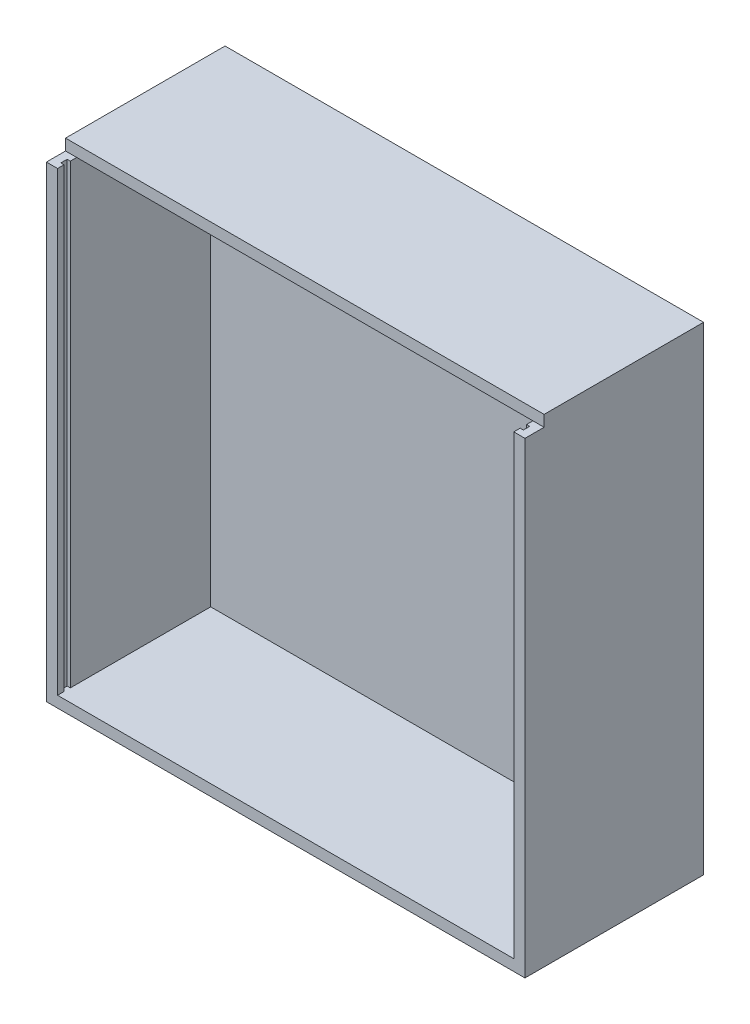
ISO-10303-21;
HEADER;
FILE_DESCRIPTION(('STEP AP214'),'2;1');
FILE_NAME('part.step','',(''),(''),'','','');
FILE_SCHEMA(('AUTOMOTIVE_DESIGN { 1 0 10303 214 1 1 1 1 }'));
ENDSEC;
DATA;
#1=APPLICATION_CONTEXT('core data for automotive mechanical design processes');
#2=APPLICATION_PROTOCOL_DEFINITION('international standard','automotive_design',2000,#1);
#3=PRODUCT_CONTEXT('',#1,'mechanical');
#4=PRODUCT('Part','Part','',(#3));
#5=PRODUCT_RELATED_PRODUCT_CATEGORY('part','',(#4));
#6=PRODUCT_DEFINITION_FORMATION('','',#4);
#7=PRODUCT_DEFINITION_CONTEXT('part definition',#1,'design');
#8=PRODUCT_DEFINITION('design','',#6,#7);
#9=PRODUCT_DEFINITION_SHAPE('','',#8);
#10=(LENGTH_UNIT() NAMED_UNIT(*) SI_UNIT(.MILLI.,.METRE.));
#11=(NAMED_UNIT(*) PLANE_ANGLE_UNIT() SI_UNIT($,.RADIAN.));
#12=(NAMED_UNIT(*) SI_UNIT($,.STERADIAN.) SOLID_ANGLE_UNIT());
#13=UNCERTAINTY_MEASURE_WITH_UNIT(LENGTH_MEASURE(1.E-05),#10,'distance_accuracy_value','');
#14=(GEOMETRIC_REPRESENTATION_CONTEXT(3) GLOBAL_UNCERTAINTY_ASSIGNED_CONTEXT((#13)) GLOBAL_UNIT_ASSIGNED_CONTEXT((#10,
#11,#12)) REPRESENTATION_CONTEXT('',''));
#15=CARTESIAN_POINT('',(0.,0.,0.));
#16=DIRECTION('',(0.,0.,1.));
#17=DIRECTION('',(1.,0.,0.));
#18=AXIS2_PLACEMENT_3D('',#15,#16,#17);
#19=CARTESIAN_POINT('',(-71.5,71.5,50.));
#20=DIRECTION('',(1.,0.,0.));
#21=DIRECTION('',(0.,0.,-1.));
#22=AXIS2_PLACEMENT_3D('',#19,#20,#21);
#23=PLANE('',#22);
#24=DIRECTION('',(0.,0.,-1.));
#25=VECTOR('',#24,1.);
#26=CARTESIAN_POINT('',(-71.5,71.5,56.));
#27=LINE('',#26,#25);
#28=CARTESIAN_POINT('',(-71.5,71.5,52.));
#29=VERTEX_POINT('',#28);
#30=CARTESIAN_POINT('',(-71.5,71.5,50.));
#31=VERTEX_POINT('',#30);
#32=EDGE_CURVE('E285',#29,#31,#27,.T.);
#33=ORIENTED_EDGE('',*,*,#32,.F.);
#34=DIRECTION('',(0.,-1.,0.));
#35=VECTOR('',#34,1.);
#36=CARTESIAN_POINT('',(-71.5,71.5,52.));
#37=LINE('',#36,#35);
#38=CARTESIAN_POINT('',(-71.5,-71.5,52.));
#39=VERTEX_POINT('',#38);
#40=EDGE_CURVE('E184',#29,#39,#37,.T.);
#41=ORIENTED_EDGE('',*,*,#40,.T.);
#42=DIRECTION('',(0.,0.,-1.));
#43=VECTOR('',#42,1.);
#44=CARTESIAN_POINT('',(-71.5,-71.5,50.));
#45=LINE('',#44,#43);
#46=CARTESIAN_POINT('',(-71.5,-71.5,8.));
#47=VERTEX_POINT('',#46);
#48=EDGE_CURVE('E314',#39,#47,#45,.T.);
#49=ORIENTED_EDGE('',*,*,#48,.T.);
#50=DIRECTION('',(0.,-1.,0.));
#51=VECTOR('',#50,1.);
#52=CARTESIAN_POINT('',(-71.5,71.5,8.));
#53=LINE('',#52,#51);
#54=CARTESIAN_POINT('',(-71.5,71.5,8.));
#55=VERTEX_POINT('',#54);
#56=EDGE_CURVE('E303',#55,#47,#53,.T.);
#57=ORIENTED_EDGE('',*,*,#56,.F.);
#58=DIRECTION('',(0.,0.,-1.));
#59=VECTOR('',#58,1.);
#60=CARTESIAN_POINT('',(-71.5,71.5,50.));
#61=LINE('',#60,#59);
#62=EDGE_CURVE('E319',#31,#55,#61,.T.);
#63=ORIENTED_EDGE('',*,*,#62,.F.);
#64=EDGE_LOOP('',(#33,#41,#49,#57,#63));
#65=FACE_BOUND('',#64,.T.);
#66=ADVANCED_FACE('F39',(#65),#23,.T.);
#67=CARTESIAN_POINT('',(-71.5,-71.5,56.));
#68=VERTEX_POINT('',#67);
#69=CARTESIAN_POINT('',(-71.5,-71.5,54.));
#70=VERTEX_POINT('',#69);
#71=EDGE_CURVE('E315',#68,#70,#45,.T.);
#72=ORIENTED_EDGE('',*,*,#71,.T.);
#73=DIRECTION('',(0.,1.,0.));
#74=VECTOR('',#73,1.);
#75=CARTESIAN_POINT('',(-71.5,71.5,54.));
#76=LINE('',#75,#74);
#77=CARTESIAN_POINT('',(-71.5,71.5,54.));
#78=VERTEX_POINT('',#77);
#79=EDGE_CURVE('E200',#70,#78,#76,.T.);
#80=ORIENTED_EDGE('',*,*,#79,.T.);
#81=CARTESIAN_POINT('',(-71.5,71.5,56.));
#82=VERTEX_POINT('',#81);
#83=EDGE_CURVE('E286',#82,#78,#27,.T.);
#84=ORIENTED_EDGE('',*,*,#83,.F.);
#85=DIRECTION('',(0.,1.,0.));
#86=VECTOR('',#85,1.);
#87=CARTESIAN_POINT('',(-71.5,-71.5,56.));
#88=LINE('',#87,#86);
#89=EDGE_CURVE('E236',#68,#82,#88,.T.);
#90=ORIENTED_EDGE('',*,*,#89,.F.);
#91=EDGE_LOOP('',(#72,#80,#84,#90));
#92=FACE_BOUND('',#91,.T.);
#93=ADVANCED_FACE('F424',(#92),#23,.T.);
#94=CARTESIAN_POINT('',(-75.,71.5,56.));
#95=DIRECTION('',(0.,1.,0.));
#96=DIRECTION('',(0.,0.,1.));
#97=AXIS2_PLACEMENT_3D('',#94,#95,#96);
#98=PLANE('',#97);
#99=DIRECTION('',(0.,0.,-1.));
#100=VECTOR('',#99,1.);
#101=CARTESIAN_POINT('',(-72.5,71.5,52.));
#102=LINE('',#101,#100);
#103=CARTESIAN_POINT('',(-72.5,71.5,54.));
#104=VERTEX_POINT('',#103);
#105=CARTESIAN_POINT('',(-72.5,71.5,52.));
#106=VERTEX_POINT('',#105);
#107=EDGE_CURVE('E55',#104,#106,#102,.T.);
#108=ORIENTED_EDGE('',*,*,#107,.T.);
#109=DIRECTION('',(1.,0.,0.));
#110=VECTOR('',#109,1.);
#111=CARTESIAN_POINT('',(-72.5,71.5,52.));
#112=LINE('',#111,#110);
#113=EDGE_CURVE('E181',#106,#29,#112,.T.);
#114=ORIENTED_EDGE('',*,*,#113,.T.);
#115=ORIENTED_EDGE('',*,*,#32,.T.);
#116=DIRECTION('',(1.,0.,0.));
#117=VECTOR('',#116,1.);
#118=CARTESIAN_POINT('',(-75.,71.5,50.));
#119=LINE('',#118,#117);
#120=CARTESIAN_POINT('',(-75.,71.5,50.));
#121=VERTEX_POINT('',#120);
#122=EDGE_CURVE('E235',#121,#31,#119,.T.);
#123=ORIENTED_EDGE('',*,*,#122,.F.);
#124=DIRECTION('',(0.,0.,-1.));
#125=VECTOR('',#124,1.);
#126=CARTESIAN_POINT('',(-75.,71.5,56.));
#127=LINE('',#126,#125);
#128=CARTESIAN_POINT('',(-75.,71.5,56.));
#129=VERTEX_POINT('',#128);
#130=EDGE_CURVE('E282',#129,#121,#127,.T.);
#131=ORIENTED_EDGE('',*,*,#130,.F.);
#132=DIRECTION('',(1.,0.,0.));
#133=VECTOR('',#132,1.);
#134=CARTESIAN_POINT('',(-75.,71.5,56.));
#135=LINE('',#134,#133);
#136=EDGE_CURVE('E239',#129,#82,#135,.T.);
#137=ORIENTED_EDGE('',*,*,#136,.T.);
#138=ORIENTED_EDGE('',*,*,#83,.T.);
#139=DIRECTION('',(-1.,0.,0.));
#140=VECTOR('',#139,1.);
#141=CARTESIAN_POINT('',(-75.,71.5,54.));
#142=LINE('',#141,#140);
#143=EDGE_CURVE('E11',#78,#104,#142,.T.);
#144=ORIENTED_EDGE('',*,*,#143,.T.);
#145=EDGE_LOOP('',(#108,#114,#115,#123,#131,#137,#138,#144));
#146=FACE_BOUND('',#145,.T.);
#147=ADVANCED_FACE('F189',(#146),#98,.T.);
#148=CARTESIAN_POINT('',(71.5,-71.5,50.));
#149=DIRECTION('',(-1.,0.,0.));
#150=DIRECTION('',(0.,0.,1.));
#151=AXIS2_PLACEMENT_3D('',#148,#149,#150);
#152=PLANE('',#151);
#153=DIRECTION('',(0.,-1.,0.));
#154=VECTOR('',#153,1.);
#155=CARTESIAN_POINT('',(71.5,-71.5,52.));
#156=LINE('',#155,#154);
#157=CARTESIAN_POINT('',(71.5,71.5,52.));
#158=VERTEX_POINT('',#157);
#159=CARTESIAN_POINT('',(71.5,-71.5,52.));
#160=VERTEX_POINT('',#159);
#161=EDGE_CURVE('E232',#158,#160,#156,.T.);
#162=ORIENTED_EDGE('',*,*,#161,.F.);
#163=DIRECTION('',(0.,0.,-1.));
#164=VECTOR('',#163,1.);
#165=CARTESIAN_POINT('',(71.5,71.5,56.));
#166=LINE('',#165,#164);
#167=CARTESIAN_POINT('',(71.5,71.5,50.));
#168=VERTEX_POINT('',#167);
#169=EDGE_CURVE('E268',#158,#168,#166,.T.);
#170=ORIENTED_EDGE('',*,*,#169,.T.);
#171=DIRECTION('',(0.,0.,-1.));
#172=VECTOR('',#171,1.);
#173=CARTESIAN_POINT('',(71.5,71.5,50.));
#174=LINE('',#173,#172);
#175=CARTESIAN_POINT('',(71.5,71.5,8.));
#176=VERTEX_POINT('',#175);
#177=EDGE_CURVE('E322',#168,#176,#174,.T.);
#178=ORIENTED_EDGE('',*,*,#177,.T.);
#179=DIRECTION('',(0.,1.,0.));
#180=VECTOR('',#179,1.);
#181=CARTESIAN_POINT('',(71.5,-71.5,8.));
#182=LINE('',#181,#180);
#183=CARTESIAN_POINT('',(71.5,-71.5,8.));
#184=VERTEX_POINT('',#183);
#185=EDGE_CURVE('E289',#184,#176,#182,.T.);
#186=ORIENTED_EDGE('',*,*,#185,.F.);
#187=DIRECTION('',(0.,0.,-1.));
#188=VECTOR('',#187,1.);
#189=CARTESIAN_POINT('',(71.5,-71.5,50.));
#190=LINE('',#189,#188);
#191=EDGE_CURVE('E294',#160,#184,#190,.T.);
#192=ORIENTED_EDGE('',*,*,#191,.F.);
#193=EDGE_LOOP('',(#162,#170,#178,#186,#192));
#194=FACE_BOUND('',#193,.T.);
#195=ADVANCED_FACE('F385',(#194),#152,.T.);
#196=CARTESIAN_POINT('',(75.,-75.,8.));
#197=DIRECTION('',(-1.,0.,0.));
#198=DIRECTION('',(0.,0.,1.));
#199=AXIS2_PLACEMENT_3D('',#196,#197,#198);
#200=PLANE('',#199);
#201=DIRECTION('',(0.,1.,0.));
#202=VECTOR('',#201,1.);
#203=CARTESIAN_POINT('',(75.,-75.,0.));
#204=LINE('',#203,#202);
#205=CARTESIAN_POINT('',(75.,-75.,0.));
#206=VERTEX_POINT('',#205);
#207=CARTESIAN_POINT('',(75.,75.,0.));
#208=VERTEX_POINT('',#207);
#209=EDGE_CURVE('E337',#206,#208,#204,.T.);
#210=ORIENTED_EDGE('',*,*,#209,.T.);
#211=DIRECTION('',(0.,0.,-1.));
#212=VECTOR('',#211,1.);
#213=CARTESIAN_POINT('',(75.,75.,8.));
#214=LINE('',#213,#212);
#215=CARTESIAN_POINT('',(75.,75.,50.));
#216=VERTEX_POINT('',#215);
#217=EDGE_CURVE('E362',#216,#208,#214,.T.);
#218=ORIENTED_EDGE('',*,*,#217,.F.);
#219=DIRECTION('',(0.,1.,0.));
#220=VECTOR('',#219,1.);
#221=CARTESIAN_POINT('',(75.,75.,50.));
#222=LINE('',#221,#220);
#223=CARTESIAN_POINT('',(75.,71.5,50.));
#224=VERTEX_POINT('',#223);
#225=EDGE_CURVE('E330',#224,#216,#222,.T.);
#226=ORIENTED_EDGE('',*,*,#225,.F.);
#227=DIRECTION('',(0.,0.,-1.));
#228=VECTOR('',#227,1.);
#229=CARTESIAN_POINT('',(75.,71.5,56.));
#230=LINE('',#229,#228);
#231=CARTESIAN_POINT('',(75.,71.5,56.));
#232=VERTEX_POINT('',#231);
#233=EDGE_CURVE('E279',#232,#224,#230,.T.);
#234=ORIENTED_EDGE('',*,*,#233,.F.);
#235=DIRECTION('',(0.,1.,0.));
#236=VECTOR('',#235,1.);
#237=CARTESIAN_POINT('',(75.,71.5,56.));
#238=LINE('',#237,#236);
#239=CARTESIAN_POINT('',(75.,-75.,56.));
#240=VERTEX_POINT('',#239);
#241=EDGE_CURVE('E252',#232,#240,#238,.F.);
#242=ORIENTED_EDGE('',*,*,#241,.T.);
#243=DIRECTION('',(0.,0.,-1.));
#244=VECTOR('',#243,1.);
#245=CARTESIAN_POINT('',(75.,-75.,8.));
#246=LINE('',#245,#244);
#247=EDGE_CURVE('E350',#240,#206,#246,.T.);
#248=ORIENTED_EDGE('',*,*,#247,.T.);
#249=EDGE_LOOP('',(#210,#218,#226,#234,#242,#248));
#250=FACE_BOUND('',#249,.T.);
#251=ADVANCED_FACE('F41',(#250),#200,.F.);
#252=CARTESIAN_POINT('',(-75.,75.,8.));
#253=DIRECTION('',(0.,-1.,0.));
#254=DIRECTION('',(0.,0.,-1.));
#255=AXIS2_PLACEMENT_3D('',#252,#253,#254);
#256=PLANE('',#255);
#257=DIRECTION('',(-1.,0.,0.));
#258=VECTOR('',#257,1.);
#259=CARTESIAN_POINT('',(-75.,75.,0.));
#260=LINE('',#259,#258);
#261=CARTESIAN_POINT('',(-75.,75.,0.));
#262=VERTEX_POINT('',#261);
#263=EDGE_CURVE('E341',#208,#262,#260,.T.);
#264=ORIENTED_EDGE('',*,*,#263,.T.);
#265=DIRECTION('',(0.,0.,-1.));
#266=VECTOR('',#265,1.);
#267=CARTESIAN_POINT('',(-75.,75.,8.));
#268=LINE('',#267,#266);
#269=CARTESIAN_POINT('',(-75.,75.,50.));
#270=VERTEX_POINT('',#269);
#271=EDGE_CURVE('E358',#270,#262,#268,.T.);
#272=ORIENTED_EDGE('',*,*,#271,.F.);
#273=DIRECTION('',(-1.,0.,0.));
#274=VECTOR('',#273,1.);
#275=CARTESIAN_POINT('',(-75.,75.,50.));
#276=LINE('',#275,#274);
#277=EDGE_CURVE('E333',#216,#270,#276,.T.);
#278=ORIENTED_EDGE('',*,*,#277,.F.);
#279=ORIENTED_EDGE('',*,*,#217,.T.);
#280=EDGE_LOOP('',(#264,#272,#278,#279));
#281=FACE_BOUND('',#280,.T.);
#282=ADVANCED_FACE('F453',(#281),#256,.F.);
#283=CARTESIAN_POINT('',(-75.,-75.,8.));
#284=DIRECTION('',(1.,0.,0.));
#285=DIRECTION('',(0.,0.,-1.));
#286=AXIS2_PLACEMENT_3D('',#283,#284,#285);
#287=PLANE('',#286);
#288=DIRECTION('',(0.,-1.,0.));
#289=VECTOR('',#288,1.);
#290=CARTESIAN_POINT('',(-75.,-75.,0.));
#291=LINE('',#290,#289);
#292=CARTESIAN_POINT('',(-75.,-75.,0.));
#293=VERTEX_POINT('',#292);
#294=EDGE_CURVE('E344',#262,#293,#291,.T.);
#295=ORIENTED_EDGE('',*,*,#294,.T.);
#296=DIRECTION('',(0.,0.,-1.));
#297=VECTOR('',#296,1.);
#298=CARTESIAN_POINT('',(-75.,-75.,8.));
#299=LINE('',#298,#297);
#300=CARTESIAN_POINT('',(-75.,-75.,56.));
#301=VERTEX_POINT('',#300);
#302=EDGE_CURVE('E354',#301,#293,#299,.T.);
#303=ORIENTED_EDGE('',*,*,#302,.F.);
#304=DIRECTION('',(0.,1.,0.));
#305=VECTOR('',#304,1.);
#306=CARTESIAN_POINT('',(-75.,-71.5,56.));
#307=LINE('',#306,#305);
#308=EDGE_CURVE('E244',#301,#129,#307,.T.);
#309=ORIENTED_EDGE('',*,*,#308,.T.);
#310=ORIENTED_EDGE('',*,*,#130,.T.);
#311=DIRECTION('',(0.,-1.,0.));
#312=VECTOR('',#311,1.);
#313=CARTESIAN_POINT('',(-75.,-75.,50.));
#314=LINE('',#313,#312);
#315=EDGE_CURVE('E326',#270,#121,#314,.T.);
#316=ORIENTED_EDGE('',*,*,#315,.F.);
#317=ORIENTED_EDGE('',*,*,#271,.T.);
#318=EDGE_LOOP('',(#295,#303,#309,#310,#316,#317));
#319=FACE_BOUND('',#318,.T.);
#320=ADVANCED_FACE('F447',(#319),#287,.F.);
#321=CARTESIAN_POINT('',(-75.,-75.,8.));
#322=DIRECTION('',(0.,1.,0.));
#323=DIRECTION('',(0.,0.,1.));
#324=AXIS2_PLACEMENT_3D('',#321,#322,#323);
#325=PLANE('',#324);
#326=DIRECTION('',(1.,0.,0.));
#327=VECTOR('',#326,1.);
#328=CARTESIAN_POINT('',(-75.,-75.,0.));
#329=LINE('',#328,#327);
#330=EDGE_CURVE('E347',#293,#206,#329,.T.);
#331=ORIENTED_EDGE('',*,*,#330,.T.);
#332=ORIENTED_EDGE('',*,*,#247,.F.);
#333=DIRECTION('',(1.,0.,0.));
#334=VECTOR('',#333,1.);
#335=CARTESIAN_POINT('',(71.5,-75.,56.));
#336=LINE('',#335,#334);
#337=EDGE_CURVE('E248',#240,#301,#336,.F.);
#338=ORIENTED_EDGE('',*,*,#337,.T.);
#339=ORIENTED_EDGE('',*,*,#302,.T.);
#340=EDGE_LOOP('',(#331,#332,#338,#339));
#341=FACE_BOUND('',#340,.T.);
#342=ADVANCED_FACE('F442',(#341),#325,.F.);
#343=CARTESIAN_POINT('',(0.,0.,0.));
#344=DIRECTION('',(0.,0.,-1.));
#345=DIRECTION('',(-1.,0.,0.));
#346=AXIS2_PLACEMENT_3D('',#343,#344,#345);
#347=PLANE('',#346);
#348=ORIENTED_EDGE('',*,*,#209,.F.);
#349=ORIENTED_EDGE('',*,*,#330,.F.);
#350=ORIENTED_EDGE('',*,*,#294,.F.);
#351=ORIENTED_EDGE('',*,*,#263,.F.);
#352=EDGE_LOOP('',(#348,#349,#350,#351));
#353=FACE_BOUND('',#352,.T.);
#354=ADVANCED_FACE('F438',(#353),#347,.T.);
#355=CARTESIAN_POINT('',(0.,0.,50.));
#356=DIRECTION('',(0.,0.,-1.));
#357=DIRECTION('',(-1.,0.,0.));
#358=AXIS2_PLACEMENT_3D('',#355,#356,#357);
#359=PLANE('',#358);
#360=DIRECTION('',(-1.,0.,0.));
#361=VECTOR('',#360,1.);
#362=CARTESIAN_POINT('',(71.5,71.5,50.));
#363=LINE('',#362,#361);
#364=EDGE_CURVE('E290',#168,#31,#363,.T.);
#365=ORIENTED_EDGE('',*,*,#364,.F.);
#366=DIRECTION('',(1.,0.,0.));
#367=VECTOR('',#366,1.);
#368=CARTESIAN_POINT('',(71.5,71.5,50.));
#369=LINE('',#368,#367);
#370=EDGE_CURVE('E240',#168,#224,#369,.T.);
#371=ORIENTED_EDGE('',*,*,#370,.T.);
#372=ORIENTED_EDGE('',*,*,#225,.T.);
#373=ORIENTED_EDGE('',*,*,#277,.T.);
#374=ORIENTED_EDGE('',*,*,#315,.T.);
#375=ORIENTED_EDGE('',*,*,#122,.T.);
#376=EDGE_LOOP('',(#365,#371,#372,#373,#374,#375));
#377=FACE_BOUND('',#376,.T.);
#378=ADVANCED_FACE('F405',(#377),#359,.F.);
#379=DIRECTION('',(0.,1.,0.));
#380=VECTOR('',#379,1.);
#381=CARTESIAN_POINT('',(71.5,-71.5,54.));
#382=LINE('',#381,#380);
#383=CARTESIAN_POINT('',(71.5,-71.5,54.));
#384=VERTEX_POINT('',#383);
#385=CARTESIAN_POINT('',(71.5,71.5,54.));
#386=VERTEX_POINT('',#385);
#387=EDGE_CURVE('E63',#384,#386,#382,.T.);
#388=ORIENTED_EDGE('',*,*,#387,.F.);
#389=CARTESIAN_POINT('',(71.5,-71.5,56.));
#390=VERTEX_POINT('',#389);
#391=EDGE_CURVE('E310',#390,#384,#190,.T.);
#392=ORIENTED_EDGE('',*,*,#391,.F.);
#393=DIRECTION('',(0.,-1.,0.));
#394=VECTOR('',#393,1.);
#395=CARTESIAN_POINT('',(71.5,71.5,56.));
#396=LINE('',#395,#394);
#397=CARTESIAN_POINT('',(71.5,71.5,56.));
#398=VERTEX_POINT('',#397);
#399=EDGE_CURVE('E260',#398,#390,#396,.T.);
#400=ORIENTED_EDGE('',*,*,#399,.F.);
#401=EDGE_CURVE('E275',#398,#386,#166,.T.);
#402=ORIENTED_EDGE('',*,*,#401,.T.);
#403=EDGE_LOOP('',(#388,#392,#400,#402));
#404=FACE_BOUND('',#403,.T.);
#405=ADVANCED_FACE('F434',(#404),#152,.T.);
#406=CARTESIAN_POINT('',(71.5,71.5,50.));
#407=DIRECTION('',(0.,-1.,0.));
#408=DIRECTION('',(0.,0.,-1.));
#409=AXIS2_PLACEMENT_3D('',#406,#407,#408);
#410=PLANE('',#409);
#411=DIRECTION('',(-1.,0.,0.));
#412=VECTOR('',#411,1.);
#413=CARTESIAN_POINT('',(71.5,71.5,8.));
#414=LINE('',#413,#412);
#415=EDGE_CURVE('E299',#176,#55,#414,.T.);
#416=ORIENTED_EDGE('',*,*,#415,.F.);
#417=ORIENTED_EDGE('',*,*,#177,.F.);
#418=ORIENTED_EDGE('',*,*,#364,.T.);
#419=ORIENTED_EDGE('',*,*,#62,.T.);
#420=EDGE_LOOP('',(#416,#417,#418,#419));
#421=FACE_BOUND('',#420,.T.);
#422=ADVANCED_FACE('F409',(#421),#410,.T.);
#423=CARTESIAN_POINT('',(-71.5,-71.5,50.));
#424=DIRECTION('',(0.,1.,0.));
#425=DIRECTION('',(0.,0.,1.));
#426=AXIS2_PLACEMENT_3D('',#423,#424,#425);
#427=PLANE('',#426);
#428=ORIENTED_EDGE('',*,*,#48,.F.);
#429=DIRECTION('',(-1.,0.,0.));
#430=VECTOR('',#429,1.);
#431=CARTESIAN_POINT('',(-72.5,-71.5,52.));
#432=LINE('',#431,#430);
#433=CARTESIAN_POINT('',(-72.5,-71.5,52.));
#434=VERTEX_POINT('',#433);
#435=EDGE_CURVE('E196',#39,#434,#432,.T.);
#436=ORIENTED_EDGE('',*,*,#435,.T.);
#437=DIRECTION('',(0.,0.,1.));
#438=VECTOR('',#437,1.);
#439=CARTESIAN_POINT('',(-72.5,-71.5,52.));
#440=LINE('',#439,#438);
#441=CARTESIAN_POINT('',(-72.5,-71.5,54.));
#442=VERTEX_POINT('',#441);
#443=EDGE_CURVE('E175',#434,#442,#440,.T.);
#444=ORIENTED_EDGE('',*,*,#443,.T.);
#445=DIRECTION('',(1.,0.,0.));
#446=VECTOR('',#445,1.);
#447=CARTESIAN_POINT('',(-72.5,-71.5,54.));
#448=LINE('',#447,#446);
#449=EDGE_CURVE('E204',#442,#70,#448,.T.);
#450=ORIENTED_EDGE('',*,*,#449,.T.);
#451=ORIENTED_EDGE('',*,*,#71,.F.);
#452=DIRECTION('',(-1.,0.,0.));
#453=VECTOR('',#452,1.);
#454=CARTESIAN_POINT('',(71.5,-71.5,56.));
#455=LINE('',#454,#453);
#456=EDGE_CURVE('E264',#390,#68,#455,.T.);
#457=ORIENTED_EDGE('',*,*,#456,.F.);
#458=ORIENTED_EDGE('',*,*,#391,.T.);
#459=DIRECTION('',(-1.,0.,0.));
#460=VECTOR('',#459,1.);
#461=CARTESIAN_POINT('',(72.5,-71.5,54.));
#462=LINE('',#461,#460);
#463=CARTESIAN_POINT('',(72.5,-71.5,54.));
#464=VERTEX_POINT('',#463);
#465=EDGE_CURVE('E215',#464,#384,#462,.T.);
#466=ORIENTED_EDGE('',*,*,#465,.F.);
#467=DIRECTION('',(0.,0.,1.));
#468=VECTOR('',#467,1.);
#469=CARTESIAN_POINT('',(72.5,-71.5,52.));
#470=LINE('',#469,#468);
#471=CARTESIAN_POINT('',(72.5,-71.5,52.));
#472=VERTEX_POINT('',#471);
#473=EDGE_CURVE('E208',#472,#464,#470,.T.);
#474=ORIENTED_EDGE('',*,*,#473,.F.);
#475=DIRECTION('',(1.,0.,0.));
#476=VECTOR('',#475,1.);
#477=CARTESIAN_POINT('',(72.5,-71.5,52.));
#478=LINE('',#477,#476);
#479=EDGE_CURVE('E211',#160,#472,#478,.T.);
#480=ORIENTED_EDGE('',*,*,#479,.F.);
#481=ORIENTED_EDGE('',*,*,#191,.T.);
#482=DIRECTION('',(1.,0.,0.));
#483=VECTOR('',#482,1.);
#484=CARTESIAN_POINT('',(-71.5,-71.5,8.));
#485=LINE('',#484,#483);
#486=EDGE_CURVE('E295',#47,#184,#485,.T.);
#487=ORIENTED_EDGE('',*,*,#486,.F.);
#488=EDGE_LOOP('',(#428,#436,#444,#450,#451,#457,#458,#466,#474,#480,#481,#487));
#489=FACE_BOUND('',#488,.T.);
#490=ADVANCED_FACE('F398',(#489),#427,.T.);
#491=CARTESIAN_POINT('',(0.,0.,8.));
#492=DIRECTION('',(0.,0.,-1.));
#493=DIRECTION('',(-1.,0.,0.));
#494=AXIS2_PLACEMENT_3D('',#491,#492,#493);
#495=PLANE('',#494);
#496=ORIENTED_EDGE('',*,*,#486,.T.);
#497=ORIENTED_EDGE('',*,*,#185,.T.);
#498=ORIENTED_EDGE('',*,*,#415,.T.);
#499=ORIENTED_EDGE('',*,*,#56,.T.);
#500=EDGE_LOOP('',(#496,#497,#498,#499));
#501=FACE_BOUND('',#500,.T.);
#502=ADVANCED_FACE('F411',(#501),#495,.F.);
#503=CARTESIAN_POINT('',(71.5,71.5,56.));
#504=DIRECTION('',(0.,1.,0.));
#505=DIRECTION('',(0.,0.,1.));
#506=AXIS2_PLACEMENT_3D('',#503,#504,#505);
#507=PLANE('',#506);
#508=DIRECTION('',(-1.,0.,0.));
#509=VECTOR('',#508,1.);
#510=CARTESIAN_POINT('',(72.5,71.5,52.));
#511=LINE('',#510,#509);
#512=CARTESIAN_POINT('',(72.5,71.5,52.));
#513=VERTEX_POINT('',#512);
#514=EDGE_CURVE('E219',#513,#158,#511,.T.);
#515=ORIENTED_EDGE('',*,*,#514,.F.);
#516=DIRECTION('',(0.,0.,-1.));
#517=VECTOR('',#516,1.);
#518=CARTESIAN_POINT('',(72.5,71.5,52.));
#519=LINE('',#518,#517);
#520=CARTESIAN_POINT('',(72.5,71.5,54.));
#521=VERTEX_POINT('',#520);
#522=EDGE_CURVE('E207',#521,#513,#519,.T.);
#523=ORIENTED_EDGE('',*,*,#522,.F.);
#524=DIRECTION('',(1.,0.,0.));
#525=VECTOR('',#524,1.);
#526=CARTESIAN_POINT('',(71.5,71.5,54.));
#527=LINE('',#526,#525);
#528=EDGE_CURVE('E48',#386,#521,#527,.T.);
#529=ORIENTED_EDGE('',*,*,#528,.F.);
#530=ORIENTED_EDGE('',*,*,#401,.F.);
#531=DIRECTION('',(1.,0.,0.));
#532=VECTOR('',#531,1.);
#533=CARTESIAN_POINT('',(71.5,71.5,56.));
#534=LINE('',#533,#532);
#535=EDGE_CURVE('E256',#398,#232,#534,.T.);
#536=ORIENTED_EDGE('',*,*,#535,.T.);
#537=ORIENTED_EDGE('',*,*,#233,.T.);
#538=ORIENTED_EDGE('',*,*,#370,.F.);
#539=ORIENTED_EDGE('',*,*,#169,.F.);
#540=EDGE_LOOP('',(#515,#523,#529,#530,#536,#537,#538,#539));
#541=FACE_BOUND('',#540,.T.);
#542=ADVANCED_FACE('F376',(#541),#507,.T.);
#543=CARTESIAN_POINT('',(0.,0.,56.));
#544=DIRECTION('',(0.,0.,-1.));
#545=DIRECTION('',(-1.,0.,0.));
#546=AXIS2_PLACEMENT_3D('',#543,#544,#545);
#547=PLANE('',#546);
#548=ORIENTED_EDGE('',*,*,#89,.T.);
#549=ORIENTED_EDGE('',*,*,#136,.F.);
#550=ORIENTED_EDGE('',*,*,#308,.F.);
#551=ORIENTED_EDGE('',*,*,#337,.F.);
#552=ORIENTED_EDGE('',*,*,#241,.F.);
#553=ORIENTED_EDGE('',*,*,#535,.F.);
#554=ORIENTED_EDGE('',*,*,#399,.T.);
#555=ORIENTED_EDGE('',*,*,#456,.T.);
#556=EDGE_LOOP('',(#548,#549,#550,#551,#552,#553,#554,#555));
#557=FACE_BOUND('',#556,.T.);
#558=ADVANCED_FACE('F418',(#557),#547,.F.);
#559=CARTESIAN_POINT('',(72.5,-74.3284271247462,52.));
#560=DIRECTION('',(0.,0.,-1.));
#561=DIRECTION('',(-1.,0.,0.));
#562=AXIS2_PLACEMENT_3D('',#559,#560,#561);
#563=PLANE('',#562);
#564=ORIENTED_EDGE('',*,*,#161,.T.);
#565=ORIENTED_EDGE('',*,*,#479,.T.);
#566=DIRECTION('',(0.,1.,0.));
#567=VECTOR('',#566,1.);
#568=CARTESIAN_POINT('',(72.5,-74.3284271247462,52.));
#569=LINE('',#568,#567);
#570=EDGE_CURVE('E212',#472,#513,#569,.T.);
#571=ORIENTED_EDGE('',*,*,#570,.T.);
#572=ORIENTED_EDGE('',*,*,#514,.T.);
#573=EDGE_LOOP('',(#564,#565,#571,#572));
#574=FACE_BOUND('',#573,.T.);
#575=ADVANCED_FACE('F381',(#574),#563,.F.);
#576=CARTESIAN_POINT('',(72.5,-74.3284271247462,52.));
#577=DIRECTION('',(1.,0.,0.));
#578=DIRECTION('',(0.,0.,-1.));
#579=AXIS2_PLACEMENT_3D('',#576,#577,#578);
#580=PLANE('',#579);
#581=ORIENTED_EDGE('',*,*,#473,.T.);
#582=DIRECTION('',(0.,1.,0.));
#583=VECTOR('',#582,1.);
#584=CARTESIAN_POINT('',(72.5,-74.3284271247462,54.));
#585=LINE('',#584,#583);
#586=EDGE_CURVE('E222',#464,#521,#585,.T.);
#587=ORIENTED_EDGE('',*,*,#586,.T.);
#588=ORIENTED_EDGE('',*,*,#522,.T.);
#589=ORIENTED_EDGE('',*,*,#570,.F.);
#590=EDGE_LOOP('',(#581,#587,#588,#589));
#591=FACE_BOUND('',#590,.T.);
#592=ADVANCED_FACE('F372',(#591),#580,.F.);
#593=CARTESIAN_POINT('',(72.5,-74.3284271247462,54.));
#594=DIRECTION('',(0.,0.,1.));
#595=DIRECTION('',(1.,0.,0.));
#596=AXIS2_PLACEMENT_3D('',#593,#594,#595);
#597=PLANE('',#596);
#598=ORIENTED_EDGE('',*,*,#387,.T.);
#599=ORIENTED_EDGE('',*,*,#528,.T.);
#600=ORIENTED_EDGE('',*,*,#586,.F.);
#601=ORIENTED_EDGE('',*,*,#465,.T.);
#602=EDGE_LOOP('',(#598,#599,#600,#601));
#603=FACE_BOUND('',#602,.T.);
#604=ADVANCED_FACE('F367',(#603),#597,.F.);
#605=CARTESIAN_POINT('',(-72.5,-74.3284271247462,52.));
#606=DIRECTION('',(0.,0.,1.));
#607=DIRECTION('',(1.,0.,0.));
#608=AXIS2_PLACEMENT_3D('',#605,#606,#607);
#609=PLANE('',#608);
#610=ORIENTED_EDGE('',*,*,#113,.F.);
#611=DIRECTION('',(0.,1.,0.));
#612=VECTOR('',#611,1.);
#613=CARTESIAN_POINT('',(-72.5,-74.3284271247462,52.));
#614=LINE('',#613,#612);
#615=EDGE_CURVE('E171',#434,#106,#614,.T.);
#616=ORIENTED_EDGE('',*,*,#615,.F.);
#617=ORIENTED_EDGE('',*,*,#435,.F.);
#618=ORIENTED_EDGE('',*,*,#40,.F.);
#619=EDGE_LOOP('',(#610,#616,#617,#618));
#620=FACE_BOUND('',#619,.T.);
#621=ADVANCED_FACE('F182',(#620),#609,.T.);
#622=CARTESIAN_POINT('',(-72.5,-74.3284271247462,52.));
#623=DIRECTION('',(1.,0.,0.));
#624=DIRECTION('',(0.,0.,-1.));
#625=AXIS2_PLACEMENT_3D('',#622,#623,#624);
#626=PLANE('',#625);
#627=ORIENTED_EDGE('',*,*,#615,.T.);
#628=ORIENTED_EDGE('',*,*,#107,.F.);
#629=DIRECTION('',(0.,1.,0.));
#630=VECTOR('',#629,1.);
#631=CARTESIAN_POINT('',(-72.5,-74.3284271247462,54.));
#632=LINE('',#631,#630);
#633=EDGE_CURVE('E178',#442,#104,#632,.T.);
#634=ORIENTED_EDGE('',*,*,#633,.F.);
#635=ORIENTED_EDGE('',*,*,#443,.F.);
#636=EDGE_LOOP('',(#627,#628,#634,#635));
#637=FACE_BOUND('',#636,.T.);
#638=ADVANCED_FACE('F173',(#637),#626,.T.);
#639=CARTESIAN_POINT('',(-72.5,-74.3284271247462,54.));
#640=DIRECTION('',(0.,0.,-1.));
#641=DIRECTION('',(-1.,0.,0.));
#642=AXIS2_PLACEMENT_3D('',#639,#640,#641);
#643=PLANE('',#642);
#644=ORIENTED_EDGE('',*,*,#449,.F.);
#645=ORIENTED_EDGE('',*,*,#633,.T.);
#646=ORIENTED_EDGE('',*,*,#143,.F.);
#647=ORIENTED_EDGE('',*,*,#79,.F.);
#648=EDGE_LOOP('',(#644,#645,#646,#647));
#649=FACE_BOUND('',#648,.T.);
#650=ADVANCED_FACE('F477',(#649),#643,.T.);
#651=CLOSED_SHELL('',(#66,#93,#147,#195,#251,#282,#320,#342,#354,#378,#405,#422,#490,#502,#542,
#558,#575,#592,#604,#621,#638,#650));
#652=MANIFOLD_SOLID_BREP('B2',#651);
#653=ADVANCED_BREP_SHAPE_REPRESENTATION('',(#18,#652),#14);
#654=SHAPE_DEFINITION_REPRESENTATION(#9,#653);
ENDSEC;
END-ISO-10303-21;
